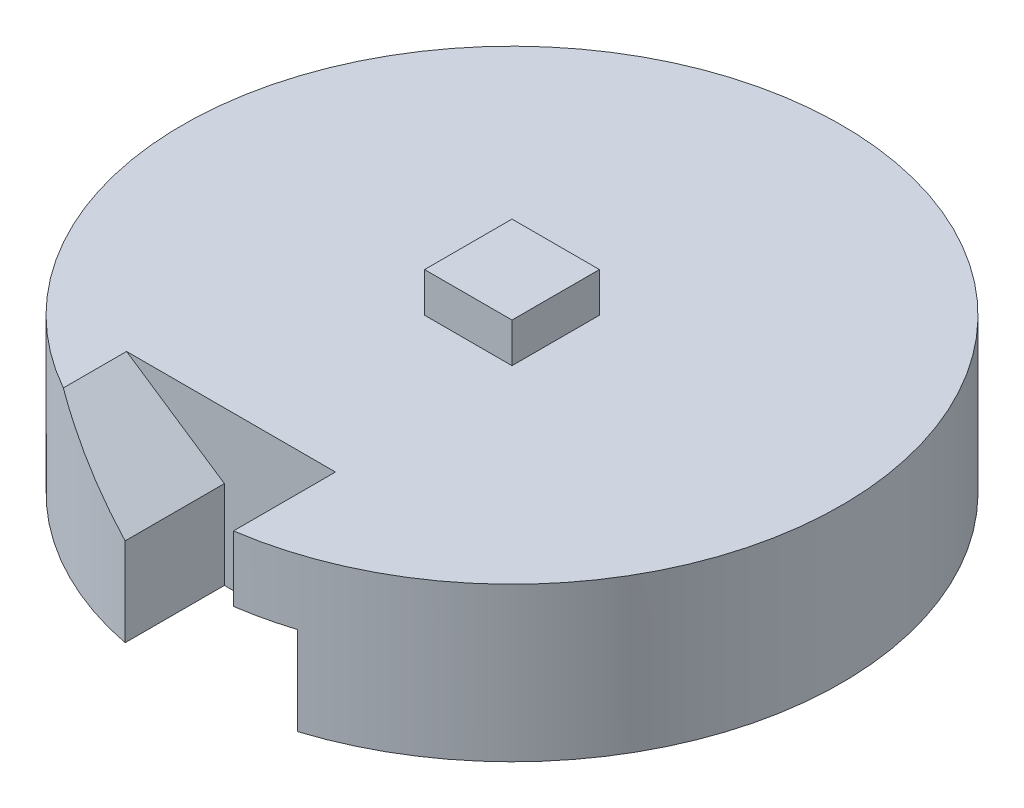
ISO-10303-21;
HEADER;
FILE_DESCRIPTION(('STEP AP214'),'2;1');
FILE_NAME('part.step','',(''),(''),'','','');
FILE_SCHEMA(('AUTOMOTIVE_DESIGN { 1 0 10303 214 1 1 1 1 }'));
ENDSEC;
DATA;
#1=APPLICATION_CONTEXT('core data for automotive mechanical design processes');
#2=APPLICATION_PROTOCOL_DEFINITION('international standard','automotive_design',2000,#1);
#3=PRODUCT_CONTEXT('',#1,'mechanical');
#4=PRODUCT('Part','Part','',(#3));
#5=PRODUCT_RELATED_PRODUCT_CATEGORY('part','',(#4));
#6=PRODUCT_DEFINITION_FORMATION('','',#4);
#7=PRODUCT_DEFINITION_CONTEXT('part definition',#1,'design');
#8=PRODUCT_DEFINITION('design','',#6,#7);
#9=PRODUCT_DEFINITION_SHAPE('','',#8);
#10=(LENGTH_UNIT() NAMED_UNIT(*) SI_UNIT(.MILLI.,.METRE.));
#11=(NAMED_UNIT(*) PLANE_ANGLE_UNIT() SI_UNIT($,.RADIAN.));
#12=(NAMED_UNIT(*) SI_UNIT($,.STERADIAN.) SOLID_ANGLE_UNIT());
#13=UNCERTAINTY_MEASURE_WITH_UNIT(LENGTH_MEASURE(1.E-05),#10,'distance_accuracy_value','');
#14=(GEOMETRIC_REPRESENTATION_CONTEXT(3) GLOBAL_UNCERTAINTY_ASSIGNED_CONTEXT((#13)) GLOBAL_UNIT_ASSIGNED_CONTEXT((#10,
#11,#12)) REPRESENTATION_CONTEXT('',''));
#15=CARTESIAN_POINT('',(0.,0.,0.));
#16=DIRECTION('',(0.,0.,1.));
#17=DIRECTION('',(1.,0.,0.));
#18=AXIS2_PLACEMENT_3D('',#15,#16,#17);
#19=CARTESIAN_POINT('',(0.,17.5,0.));
#20=DIRECTION('',(0.,1.,0.));
#21=DIRECTION('',(0.,0.,1.));
#22=AXIS2_PLACEMENT_3D('',#19,#20,#21);
#23=PLANE('',#22);
#24=DIRECTION('',(0.,0.,-1.));
#25=VECTOR('',#24,1.);
#26=CARTESIAN_POINT('',(5.40916797594821,17.5,0.));
#27=LINE('',#26,#25);
#28=CARTESIAN_POINT('',(5.40916797594821,17.5,37.1078280394848));
#29=VERTEX_POINT('',#28);
#30=CARTESIAN_POINT('',(5.40916797594821,17.5,25.5));
#31=VERTEX_POINT('',#30);
#32=EDGE_CURVE('E241',#29,#31,#27,.T.);
#33=ORIENTED_EDGE('',*,*,#32,.F.);
#34=CARTESIAN_POINT('',(0.,17.5,0.));
#35=DIRECTION('',(0.,1.,0.));
#36=DIRECTION('',(0.,0.,1.));
#37=AXIS2_PLACEMENT_3D('',#34,#35,#36);
#38=CIRCLE('',#37,37.5);
#39=CARTESIAN_POINT('',(-18.3618136354973,17.5,32.6969998626061));
#40=VERTEX_POINT('',#39);
#41=EDGE_CURVE('E226',#29,#40,#38,.T.);
#42=ORIENTED_EDGE('',*,*,#41,.T.);
#43=DIRECTION('',(0.,0.,1.));
#44=VECTOR('',#43,1.);
#45=CARTESIAN_POINT('',(-18.3618136354973,17.5,0.));
#46=LINE('',#45,#44);
#47=CARTESIAN_POINT('',(-18.3618136354973,17.5,25.5));
#48=VERTEX_POINT('',#47);
#49=EDGE_CURVE('E239',#48,#40,#46,.T.);
#50=ORIENTED_EDGE('',*,*,#49,.F.);
#51=DIRECTION('',(1.,0.,0.));
#52=VECTOR('',#51,1.);
#53=CARTESIAN_POINT('',(0.,17.5,25.5));
#54=LINE('',#53,#52);
#55=EDGE_CURVE('E205',#48,#31,#54,.T.);
#56=ORIENTED_EDGE('',*,*,#55,.T.);
#57=EDGE_LOOP('',(#33,#42,#50,#56));
#58=FACE_BOUND('',#57,.T.);
#59=DIRECTION('',(1.,0.,0.));
#60=VECTOR('',#59,1.);
#61=CARTESIAN_POINT('',(0.,17.5,-4.975));
#62=LINE('',#61,#60);
#63=CARTESIAN_POINT('',(-4.975,17.5,-4.975));
#64=VERTEX_POINT('',#63);
#65=CARTESIAN_POINT('',(4.975,17.5,-4.975));
#66=VERTEX_POINT('',#65);
#67=EDGE_CURVE('E183',#64,#66,#62,.T.);
#68=ORIENTED_EDGE('',*,*,#67,.T.);
#69=DIRECTION('',(0.,0.,1.));
#70=VECTOR('',#69,1.);
#71=CARTESIAN_POINT('',(4.975,17.5,0.));
#72=LINE('',#71,#70);
#73=CARTESIAN_POINT('',(4.975,17.5,4.975));
#74=VERTEX_POINT('',#73);
#75=EDGE_CURVE('E186',#66,#74,#72,.T.);
#76=ORIENTED_EDGE('',*,*,#75,.T.);
#77=DIRECTION('',(-1.,0.,0.));
#78=VECTOR('',#77,1.);
#79=CARTESIAN_POINT('',(0.,17.5,4.975));
#80=LINE('',#79,#78);
#81=CARTESIAN_POINT('',(-4.975,17.5,4.975));
#82=VERTEX_POINT('',#81);
#83=EDGE_CURVE('E177',#74,#82,#80,.T.);
#84=ORIENTED_EDGE('',*,*,#83,.T.);
#85=DIRECTION('',(0.,0.,-1.));
#86=VECTOR('',#85,1.);
#87=CARTESIAN_POINT('',(-4.975,17.5,0.));
#88=LINE('',#87,#86);
#89=EDGE_CURVE('E180',#82,#64,#88,.T.);
#90=ORIENTED_EDGE('',*,*,#89,.T.);
#91=EDGE_LOOP('',(#68,#76,#84,#90));
#92=FACE_BOUND('',#91,.T.);
#93=ADVANCED_FACE('F39',(#58,#92),#23,.T.);
#94=CARTESIAN_POINT('',(0.,17.5,0.));
#95=DIRECTION('',(0.,-1.,0.));
#96=DIRECTION('',(0.,0.,-1.));
#97=AXIS2_PLACEMENT_3D('',#94,#95,#96);
#98=CYLINDRICAL_SURFACE('',#97,37.5);
#99=ORIENTED_EDGE('',*,*,#41,.F.);
#100=DIRECTION('',(0.,-1.,0.));
#101=VECTOR('',#100,1.);
#102=CARTESIAN_POINT('',(5.40916797594821,17.5,37.1078280394848));
#103=LINE('',#102,#101);
#104=CARTESIAN_POINT('',(5.40916797594821,10.0586939101936,37.1078280394848));
#105=VERTEX_POINT('',#104);
#106=EDGE_CURVE('E222',#29,#105,#103,.T.);
#107=ORIENTED_EDGE('',*,*,#106,.T.);
#108=CARTESIAN_POINT('',(0.,10.0586939101936,0.));
#109=DIRECTION('',(0.,1.,0.));
#110=DIRECTION('',(0.,0.,1.));
#111=AXIS2_PLACEMENT_3D('',#108,#109,#110);
#112=CIRCLE('',#111,37.5);
#113=CARTESIAN_POINT('',(11.3377548552186,10.0586939101936,35.7450040543146));
#114=VERTEX_POINT('',#113);
#115=EDGE_CURVE('E47',#105,#114,#112,.T.);
#116=ORIENTED_EDGE('',*,*,#115,.T.);
#117=DIRECTION('',(0.,-1.,0.));
#118=VECTOR('',#117,1.);
#119=CARTESIAN_POINT('',(11.3377548552186,17.5,35.7450040543146));
#120=LINE('',#119,#118);
#121=CARTESIAN_POINT('',(11.3377548552186,0.,35.7450040543146));
#122=VERTEX_POINT('',#121);
#123=EDGE_CURVE('E216',#114,#122,#120,.T.);
#124=ORIENTED_EDGE('',*,*,#123,.T.);
#125=CARTESIAN_POINT('',(0.,0.,0.));
#126=DIRECTION('',(0.,1.,0.));
#127=DIRECTION('',(0.,0.,1.));
#128=AXIS2_PLACEMENT_3D('',#125,#126,#127);
#129=CIRCLE('',#128,37.5);
#130=CARTESIAN_POINT('',(-7.23202995206033,0.,36.7960288994954));
#131=VERTEX_POINT('',#130);
#132=EDGE_CURVE('E225',#122,#131,#129,.T.);
#133=ORIENTED_EDGE('',*,*,#132,.T.);
#134=DIRECTION('',(0.,-1.,0.));
#135=VECTOR('',#134,1.);
#136=CARTESIAN_POINT('',(-7.23202995206033,17.5,36.7960288994954));
#137=LINE('',#136,#135);
#138=CARTESIAN_POINT('',(-7.23202995206033,10.0401319165543,36.7960288994954));
#139=VERTEX_POINT('',#138);
#140=EDGE_CURVE('E213',#131,#139,#137,.F.);
#141=ORIENTED_EDGE('',*,*,#140,.T.);
#142=CARTESIAN_POINT('',(0.,5.19277899825944,0.));
#143=DIRECTION('',(-0.556765929579434,-0.830669428629433,0.));
#144=DIRECTION('',(0.830669428629433,-0.556765929579434,0.));
#145=AXIS2_PLACEMENT_3D('',#142,#143,#144);
#146=ELLIPSE('',#145,45.1443121746677,37.5);
#147=EDGE_CURVE('E219',#139,#40,#146,.T.);
#148=ORIENTED_EDGE('',*,*,#147,.T.);
#149=EDGE_LOOP('',(#99,#107,#116,#124,#133,#141,#148));
#150=FACE_BOUND('',#149,.T.);
#151=ADVANCED_FACE('F41',(#150),#98,.T.);
#152=CARTESIAN_POINT('',(0.,0.,0.));
#153=DIRECTION('',(0.,1.,0.));
#154=DIRECTION('',(0.,0.,1.));
#155=AXIS2_PLACEMENT_3D('',#152,#153,#154);
#156=PLANE('',#155);
#157=CARTESIAN_POINT('',(0.,0.,0.));
#158=DIRECTION('',(0.,1.,0.));
#159=DIRECTION('',(0.,0.,1.));
#160=AXIS2_PLACEMENT_3D('',#157,#158,#159);
#161=CIRCLE('',#160,5.);
#162=CARTESIAN_POINT('',(0.,0.,5.));
#163=VERTEX_POINT('',#162);
#164=EDGE_CURVE('E11',#163,#163,#161,.F.);
#165=ORIENTED_EDGE('',*,*,#164,.F.);
#166=EDGE_LOOP('',(#165));
#167=FACE_BOUND('',#166,.T.);
#168=ORIENTED_EDGE('',*,*,#132,.F.);
#169=DIRECTION('',(0.,0.,-1.));
#170=VECTOR('',#169,1.);
#171=CARTESIAN_POINT('',(11.3377548552186,0.,0.));
#172=LINE('',#171,#170);
#173=CARTESIAN_POINT('',(11.3377548552186,0.,25.5));
#174=VERTEX_POINT('',#173);
#175=EDGE_CURVE('E236',#122,#174,#172,.T.);
#176=ORIENTED_EDGE('',*,*,#175,.T.);
#177=DIRECTION('',(1.,0.,0.));
#178=VECTOR('',#177,1.);
#179=CARTESIAN_POINT('',(0.,0.,25.5));
#180=LINE('',#179,#178);
#181=CARTESIAN_POINT('',(-7.23202995206033,0.,25.5));
#182=VERTEX_POINT('',#181);
#183=EDGE_CURVE('E229',#182,#174,#180,.T.);
#184=ORIENTED_EDGE('',*,*,#183,.F.);
#185=DIRECTION('',(0.,0.,1.));
#186=VECTOR('',#185,1.);
#187=CARTESIAN_POINT('',(-7.23202995206033,0.,0.));
#188=LINE('',#187,#186);
#189=EDGE_CURVE('E233',#182,#131,#188,.T.);
#190=ORIENTED_EDGE('',*,*,#189,.T.);
#191=EDGE_LOOP('',(#168,#176,#184,#190));
#192=FACE_BOUND('',#191,.T.);
#193=ADVANCED_FACE('F261',(#167,#192),#156,.F.);
#194=CARTESIAN_POINT('',(5.40916797594821,10.0586939101936,25.5));
#195=DIRECTION('',(0.,1.,0.));
#196=DIRECTION('',(0.,0.,1.));
#197=AXIS2_PLACEMENT_3D('',#194,#195,#196);
#198=PLANE('',#197);
#199=DIRECTION('',(0.,0.,1.));
#200=VECTOR('',#199,1.);
#201=CARTESIAN_POINT('',(5.40916797594821,10.0586939101936,25.5));
#202=LINE('',#201,#200);
#203=CARTESIAN_POINT('',(5.40916797594821,10.0586939101936,25.5));
#204=VERTEX_POINT('',#203);
#205=EDGE_CURVE('E202',#204,#105,#202,.T.);
#206=ORIENTED_EDGE('',*,*,#205,.F.);
#207=DIRECTION('',(-1.,0.,0.));
#208=VECTOR('',#207,1.);
#209=CARTESIAN_POINT('',(5.40916797594821,10.0586939101936,25.5));
#210=LINE('',#209,#208);
#211=CARTESIAN_POINT('',(11.3377548552186,10.0586939101936,25.5));
#212=VERTEX_POINT('',#211);
#213=EDGE_CURVE('E198',#212,#204,#210,.T.);
#214=ORIENTED_EDGE('',*,*,#213,.F.);
#215=DIRECTION('',(0.,0.,1.));
#216=VECTOR('',#215,1.);
#217=CARTESIAN_POINT('',(11.3377548552186,10.0586939101936,25.5));
#218=LINE('',#217,#216);
#219=EDGE_CURVE('E206',#212,#114,#218,.T.);
#220=ORIENTED_EDGE('',*,*,#219,.T.);
#221=ORIENTED_EDGE('',*,*,#115,.F.);
#222=EDGE_LOOP('',(#206,#214,#220,#221));
#223=FACE_BOUND('',#222,.T.);
#224=ADVANCED_FACE('F247',(#223),#198,.F.);
#225=CARTESIAN_POINT('',(5.40916797594821,17.669921882635,25.5));
#226=DIRECTION('',(1.,0.,0.));
#227=DIRECTION('',(0.,1.,0.));
#228=AXIS2_PLACEMENT_3D('',#225,#226,#227);
#229=PLANE('',#228);
#230=ORIENTED_EDGE('',*,*,#32,.T.);
#231=DIRECTION('',(0.,1.,0.));
#232=VECTOR('',#231,1.);
#233=CARTESIAN_POINT('',(5.40916797594821,17.669921882635,25.5));
#234=LINE('',#233,#232);
#235=EDGE_CURVE('E189',#204,#31,#234,.T.);
#236=ORIENTED_EDGE('',*,*,#235,.F.);
#237=ORIENTED_EDGE('',*,*,#205,.T.);
#238=ORIENTED_EDGE('',*,*,#106,.F.);
#239=EDGE_LOOP('',(#230,#236,#237,#238));
#240=FACE_BOUND('',#239,.T.);
#241=ADVANCED_FACE('F252',(#240),#229,.F.);
#242=CARTESIAN_POINT('',(-18.6153293512788,17.669921882635,25.5));
#243=DIRECTION('',(-0.556765929579434,-0.830669428629433,0.));
#244=DIRECTION('',(0.830669428629433,-0.556765929579434,0.));
#245=AXIS2_PLACEMENT_3D('',#242,#243,#244);
#246=PLANE('',#245);
#247=DIRECTION('',(0.,0.,1.));
#248=VECTOR('',#247,1.);
#249=CARTESIAN_POINT('',(-7.23202995206033,10.0401319165543,25.5));
#250=LINE('',#249,#248);
#251=CARTESIAN_POINT('',(-7.23202995206033,10.0401319165543,25.5));
#252=VERTEX_POINT('',#251);
#253=EDGE_CURVE('E201',#252,#139,#250,.T.);
#254=ORIENTED_EDGE('',*,*,#253,.F.);
#255=DIRECTION('',(0.830669428629433,-0.556765929579434,0.));
#256=VECTOR('',#255,1.);
#257=CARTESIAN_POINT('',(-18.6153293512788,17.669921882635,25.5));
#258=LINE('',#257,#256);
#259=EDGE_CURVE('E192',#48,#252,#258,.T.);
#260=ORIENTED_EDGE('',*,*,#259,.F.);
#261=ORIENTED_EDGE('',*,*,#49,.T.);
#262=ORIENTED_EDGE('',*,*,#147,.F.);
#263=EDGE_LOOP('',(#254,#260,#261,#262));
#264=FACE_BOUND('',#263,.T.);
#265=ADVANCED_FACE('F269',(#264),#246,.F.);
#266=CARTESIAN_POINT('',(11.3377548552186,10.0586939101936,25.5));
#267=DIRECTION('',(1.,0.,0.));
#268=DIRECTION('',(0.,1.,0.));
#269=AXIS2_PLACEMENT_3D('',#266,#267,#268);
#270=PLANE('',#269);
#271=ORIENTED_EDGE('',*,*,#219,.F.);
#272=DIRECTION('',(0.,1.,0.));
#273=VECTOR('',#272,1.);
#274=CARTESIAN_POINT('',(11.3377548552186,10.0586939101936,25.5));
#275=LINE('',#274,#273);
#276=EDGE_CURVE('E196',#174,#212,#275,.T.);
#277=ORIENTED_EDGE('',*,*,#276,.F.);
#278=ORIENTED_EDGE('',*,*,#175,.F.);
#279=ORIENTED_EDGE('',*,*,#123,.F.);
#280=EDGE_LOOP('',(#271,#277,#278,#279));
#281=FACE_BOUND('',#280,.T.);
#282=ADVANCED_FACE('F259',(#281),#270,.F.);
#283=CARTESIAN_POINT('',(-7.23202995206033,10.0401319165543,25.5));
#284=DIRECTION('',(-1.,0.,0.));
#285=DIRECTION('',(0.,0.,1.));
#286=AXIS2_PLACEMENT_3D('',#283,#284,#285);
#287=PLANE('',#286);
#288=ORIENTED_EDGE('',*,*,#189,.F.);
#289=DIRECTION('',(0.,-1.,0.));
#290=VECTOR('',#289,1.);
#291=CARTESIAN_POINT('',(-7.23202995206033,10.0401319165543,25.5));
#292=LINE('',#291,#290);
#293=EDGE_CURVE('E194',#252,#182,#292,.T.);
#294=ORIENTED_EDGE('',*,*,#293,.F.);
#295=ORIENTED_EDGE('',*,*,#253,.T.);
#296=ORIENTED_EDGE('',*,*,#140,.F.);
#297=EDGE_LOOP('',(#288,#294,#295,#296));
#298=FACE_BOUND('',#297,.T.);
#299=ADVANCED_FACE('F264',(#298),#287,.F.);
#300=CARTESIAN_POINT('',(0.,0.,25.5));
#301=DIRECTION('',(0.,0.,1.));
#302=DIRECTION('',(1.,0.,0.));
#303=AXIS2_PLACEMENT_3D('',#300,#301,#302);
#304=PLANE('',#303);
#305=ORIENTED_EDGE('',*,*,#259,.T.);
#306=ORIENTED_EDGE('',*,*,#293,.T.);
#307=ORIENTED_EDGE('',*,*,#183,.T.);
#308=ORIENTED_EDGE('',*,*,#276,.T.);
#309=ORIENTED_EDGE('',*,*,#213,.T.);
#310=ORIENTED_EDGE('',*,*,#235,.T.);
#311=ORIENTED_EDGE('',*,*,#55,.F.);
#312=EDGE_LOOP('',(#305,#306,#307,#308,#309,#310,#311));
#313=FACE_BOUND('',#312,.T.);
#314=ADVANCED_FACE('F255',(#313),#304,.T.);
#315=CARTESIAN_POINT('',(4.975,22.,-4.975));
#316=DIRECTION('',(-1.,0.,0.));
#317=DIRECTION('',(0.,0.,1.));
#318=AXIS2_PLACEMENT_3D('',#315,#316,#317);
#319=PLANE('',#318);
#320=ORIENTED_EDGE('',*,*,#75,.F.);
#321=DIRECTION('',(0.,-1.,0.));
#322=VECTOR('',#321,1.);
#323=CARTESIAN_POINT('',(4.975,22.,-4.975));
#324=LINE('',#323,#322);
#325=CARTESIAN_POINT('',(4.975,22.,-4.975));
#326=VERTEX_POINT('',#325);
#327=EDGE_CURVE('E174',#326,#66,#324,.T.);
#328=ORIENTED_EDGE('',*,*,#327,.F.);
#329=DIRECTION('',(0.,0.,-1.));
#330=VECTOR('',#329,1.);
#331=CARTESIAN_POINT('',(4.975,22.,-4.975));
#332=LINE('',#331,#330);
#333=CARTESIAN_POINT('',(4.975,22.,4.975));
#334=VERTEX_POINT('',#333);
#335=EDGE_CURVE('E158',#334,#326,#332,.T.);
#336=ORIENTED_EDGE('',*,*,#335,.F.);
#337=DIRECTION('',(0.,-1.,0.));
#338=VECTOR('',#337,1.);
#339=CARTESIAN_POINT('',(4.975,22.,4.975));
#340=LINE('',#339,#338);
#341=EDGE_CURVE('E167',#334,#74,#340,.T.);
#342=ORIENTED_EDGE('',*,*,#341,.T.);
#343=EDGE_LOOP('',(#320,#328,#336,#342));
#344=FACE_BOUND('',#343,.T.);
#345=ADVANCED_FACE('F287',(#344),#319,.F.);
#346=CARTESIAN_POINT('',(-4.975,22.,-4.975));
#347=DIRECTION('',(0.,0.,1.));
#348=DIRECTION('',(1.,0.,0.));
#349=AXIS2_PLACEMENT_3D('',#346,#347,#348);
#350=PLANE('',#349);
#351=ORIENTED_EDGE('',*,*,#67,.F.);
#352=DIRECTION('',(0.,-1.,0.));
#353=VECTOR('',#352,1.);
#354=CARTESIAN_POINT('',(-4.975,22.,-4.975));
#355=LINE('',#354,#353);
#356=CARTESIAN_POINT('',(-4.975,22.,-4.975));
#357=VERTEX_POINT('',#356);
#358=EDGE_CURVE('E171',#357,#64,#355,.T.);
#359=ORIENTED_EDGE('',*,*,#358,.F.);
#360=DIRECTION('',(-1.,0.,0.));
#361=VECTOR('',#360,1.);
#362=CARTESIAN_POINT('',(-4.975,22.,-4.975));
#363=LINE('',#362,#361);
#364=EDGE_CURVE('E161',#326,#357,#363,.T.);
#365=ORIENTED_EDGE('',*,*,#364,.F.);
#366=ORIENTED_EDGE('',*,*,#327,.T.);
#367=EDGE_LOOP('',(#351,#359,#365,#366));
#368=FACE_BOUND('',#367,.T.);
#369=ADVANCED_FACE('F277',(#368),#350,.F.);
#370=CARTESIAN_POINT('',(-4.975,22.,-4.975));
#371=DIRECTION('',(1.,0.,0.));
#372=DIRECTION('',(0.,0.,-1.));
#373=AXIS2_PLACEMENT_3D('',#370,#371,#372);
#374=PLANE('',#373);
#375=ORIENTED_EDGE('',*,*,#89,.F.);
#376=DIRECTION('',(0.,-1.,0.));
#377=VECTOR('',#376,1.);
#378=CARTESIAN_POINT('',(-4.975,22.,4.975));
#379=LINE('',#378,#377);
#380=CARTESIAN_POINT('',(-4.975,22.,4.975));
#381=VERTEX_POINT('',#380);
#382=EDGE_CURVE('E62',#381,#82,#379,.T.);
#383=ORIENTED_EDGE('',*,*,#382,.F.);
#384=DIRECTION('',(0.,0.,1.));
#385=VECTOR('',#384,1.);
#386=CARTESIAN_POINT('',(-4.975,22.,-4.975));
#387=LINE('',#386,#385);
#388=EDGE_CURVE('E163',#357,#381,#387,.T.);
#389=ORIENTED_EDGE('',*,*,#388,.F.);
#390=ORIENTED_EDGE('',*,*,#358,.T.);
#391=EDGE_LOOP('',(#375,#383,#389,#390));
#392=FACE_BOUND('',#391,.T.);
#393=ADVANCED_FACE('F281',(#392),#374,.F.);
#394=CARTESIAN_POINT('',(-4.975,22.,4.975));
#395=DIRECTION('',(0.,0.,-1.));
#396=DIRECTION('',(-1.,0.,0.));
#397=AXIS2_PLACEMENT_3D('',#394,#395,#396);
#398=PLANE('',#397);
#399=ORIENTED_EDGE('',*,*,#83,.F.);
#400=ORIENTED_EDGE('',*,*,#341,.F.);
#401=DIRECTION('',(1.,0.,0.));
#402=VECTOR('',#401,1.);
#403=CARTESIAN_POINT('',(-4.975,22.,4.975));
#404=LINE('',#403,#402);
#405=EDGE_CURVE('E165',#381,#334,#404,.T.);
#406=ORIENTED_EDGE('',*,*,#405,.F.);
#407=ORIENTED_EDGE('',*,*,#382,.T.);
#408=EDGE_LOOP('',(#399,#400,#406,#407));
#409=FACE_BOUND('',#408,.T.);
#410=ADVANCED_FACE('F288',(#409),#398,.F.);
#411=CARTESIAN_POINT('',(0.,22.,0.));
#412=DIRECTION('',(0.,1.,0.));
#413=DIRECTION('',(0.,0.,1.));
#414=AXIS2_PLACEMENT_3D('',#411,#412,#413);
#415=PLANE('',#414);
#416=ORIENTED_EDGE('',*,*,#335,.T.);
#417=ORIENTED_EDGE('',*,*,#364,.T.);
#418=ORIENTED_EDGE('',*,*,#388,.T.);
#419=ORIENTED_EDGE('',*,*,#405,.T.);
#420=EDGE_LOOP('',(#416,#417,#418,#419));
#421=FACE_BOUND('',#420,.T.);
#422=ADVANCED_FACE('F283',(#421),#415,.T.);
#423=CARTESIAN_POINT('',(0.,-10.,0.));
#424=DIRECTION('',(0.,1.,0.));
#425=DIRECTION('',(0.,0.,1.));
#426=AXIS2_PLACEMENT_3D('',#423,#424,#425);
#427=CYLINDRICAL_SURFACE('',#426,5.);
#428=CARTESIAN_POINT('',(0.,-10.,0.));
#429=DIRECTION('',(0.,-1.,0.));
#430=DIRECTION('',(0.,0.,-1.));
#431=AXIS2_PLACEMENT_3D('',#428,#429,#430);
#432=CIRCLE('',#431,5.);
#433=CARTESIAN_POINT('',(0.,-10.,-5.));
#434=VERTEX_POINT('',#433);
#435=EDGE_CURVE('E148',#434,#434,#432,.T.);
#436=ORIENTED_EDGE('',*,*,#435,.F.);
#437=EDGE_LOOP('',(#436));
#438=FACE_BOUND('',#437,.T.);
#439=ORIENTED_EDGE('',*,*,#164,.T.);
#440=EDGE_LOOP('',(#439));
#441=FACE_BOUND('',#440,.T.);
#442=ADVANCED_FACE('F295',(#438,#441),#427,.T.);
#443=CARTESIAN_POINT('',(0.,-10.,0.));
#444=DIRECTION('',(0.,-1.,0.));
#445=DIRECTION('',(0.,0.,-1.));
#446=AXIS2_PLACEMENT_3D('',#443,#444,#445);
#447=PLANE('',#446);
#448=CARTESIAN_POINT('',(0.0180115311504414,-10.,0.00676759727533257));
#449=DIRECTION('',(0.,-1.,0.));
#450=DIRECTION('',(0.,0.,-1.));
#451=AXIS2_PLACEMENT_3D('',#448,#449,#450);
#452=CIRCLE('',#451,1.55);
#453=CARTESIAN_POINT('',(0.565734088655607,-10.,-1.44323240272467));
#454=VERTEX_POINT('',#453);
#455=CARTESIAN_POINT('',(-0.529711026354725,-10.,-1.44323240272467));
#456=VERTEX_POINT('',#455);
#457=EDGE_CURVE('E54',#454,#456,#452,.T.);
#458=ORIENTED_EDGE('',*,*,#457,.F.);
#459=DIRECTION('',(1.,0.,0.));
#460=VECTOR('',#459,1.);
#461=CARTESIAN_POINT('',(0.0180115311504414,-10.,-1.44323240272467));
#462=LINE('',#461,#460);
#463=EDGE_CURVE('E145',#456,#454,#462,.T.);
#464=ORIENTED_EDGE('',*,*,#463,.F.);
#465=EDGE_LOOP('',(#458,#464));
#466=FACE_BOUND('',#465,.T.);
#467=ORIENTED_EDGE('',*,*,#435,.T.);
#468=EDGE_LOOP('',(#467));
#469=FACE_BOUND('',#468,.T.);
#470=ADVANCED_FACE('F323',(#466,#469),#447,.T.);
#471=CARTESIAN_POINT('',(0.0180115311504414,0.,0.00676759727533257));
#472=DIRECTION('',(0.,-1.,0.));
#473=DIRECTION('',(0.,0.,-1.));
#474=AXIS2_PLACEMENT_3D('',#471,#472,#473);
#475=CYLINDRICAL_SURFACE('',#474,1.55);
#476=ORIENTED_EDGE('',*,*,#457,.T.);
#477=DIRECTION('',(0.,-1.,0.));
#478=VECTOR('',#477,1.);
#479=CARTESIAN_POINT('',(-0.529711026354725,0.,-1.44323240272467));
#480=LINE('',#479,#478);
#481=CARTESIAN_POINT('',(-0.529711026354725,0.,-1.44323240272467));
#482=VERTEX_POINT('',#481);
#483=EDGE_CURVE('E138',#482,#456,#480,.T.);
#484=ORIENTED_EDGE('',*,*,#483,.F.);
#485=CARTESIAN_POINT('',(0.0180115311504414,0.,0.00676759727533257));
#486=DIRECTION('',(0.,-1.,0.));
#487=DIRECTION('',(0.,0.,-1.));
#488=AXIS2_PLACEMENT_3D('',#485,#486,#487);
#489=CIRCLE('',#488,1.55);
#490=CARTESIAN_POINT('',(0.565734088655607,0.,-1.44323240272467));
#491=VERTEX_POINT('',#490);
#492=EDGE_CURVE('E144',#491,#482,#489,.T.);
#493=ORIENTED_EDGE('',*,*,#492,.F.);
#494=DIRECTION('',(0.,-1.,0.));
#495=VECTOR('',#494,1.);
#496=CARTESIAN_POINT('',(0.565734088655607,0.,-1.44323240272467));
#497=LINE('',#496,#495);
#498=EDGE_CURVE('E140',#491,#454,#497,.T.);
#499=ORIENTED_EDGE('',*,*,#498,.T.);
#500=EDGE_LOOP('',(#476,#484,#493,#499));
#501=FACE_BOUND('',#500,.T.);
#502=ADVANCED_FACE('F147',(#501),#475,.F.);
#503=CARTESIAN_POINT('',(0.0180115311504414,0.,-1.44323240272467));
#504=DIRECTION('',(0.,0.,-1.));
#505=DIRECTION('',(-1.,0.,0.));
#506=AXIS2_PLACEMENT_3D('',#503,#504,#505);
#507=PLANE('',#506);
#508=ORIENTED_EDGE('',*,*,#463,.T.);
#509=ORIENTED_EDGE('',*,*,#498,.F.);
#510=DIRECTION('',(-1.,0.,0.));
#511=VECTOR('',#510,1.);
#512=CARTESIAN_POINT('',(0.0180115311504414,0.,-1.44323240272467));
#513=LINE('',#512,#511);
#514=EDGE_CURVE('E135',#491,#482,#513,.T.);
#515=ORIENTED_EDGE('',*,*,#514,.T.);
#516=ORIENTED_EDGE('',*,*,#483,.T.);
#517=EDGE_LOOP('',(#508,#509,#515,#516));
#518=FACE_BOUND('',#517,.T.);
#519=ADVANCED_FACE('F137',(#518),#507,.F.);
#520=CARTESIAN_POINT('',(0.0180115311504414,0.,0.00676759727533257));
#521=DIRECTION('',(0.,-1.,0.));
#522=DIRECTION('',(0.,0.,-1.));
#523=AXIS2_PLACEMENT_3D('',#520,#521,#522);
#524=PLANE('',#523);
#525=ORIENTED_EDGE('',*,*,#514,.F.);
#526=ORIENTED_EDGE('',*,*,#492,.T.);
#527=EDGE_LOOP('',(#525,#526));
#528=FACE_BOUND('',#527,.T.);
#529=ADVANCED_FACE('F150',(#528),#524,.T.);
#530=CLOSED_SHELL('',(#93,#151,#193,#224,#241,#265,#282,#299,#314,#345,#369,#393,#410,#422,#442,
#470,#502,#519,#529));
#531=MANIFOLD_SOLID_BREP('B2',#530);
#532=ADVANCED_BREP_SHAPE_REPRESENTATION('',(#18,#531),#14);
#533=SHAPE_DEFINITION_REPRESENTATION(#9,#532);
ENDSEC;
END-ISO-10303-21;
